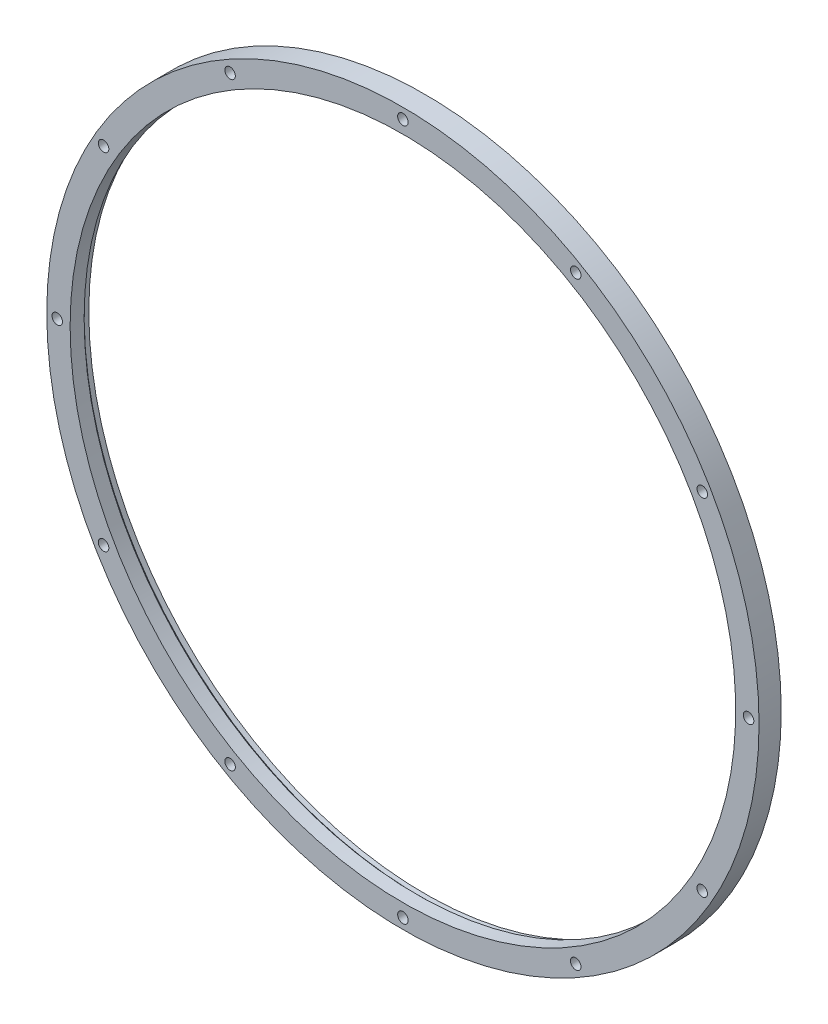
ISO-10303-21;
HEADER;
FILE_DESCRIPTION(('STEP AP214'),'2;1');
FILE_NAME('part.step','',(''),(''),'','','');
FILE_SCHEMA(('AUTOMOTIVE_DESIGN { 1 0 10303 214 1 1 1 1 }'));
ENDSEC;
DATA;
#1=APPLICATION_CONTEXT('core data for automotive mechanical design processes');
#2=APPLICATION_PROTOCOL_DEFINITION('international standard','automotive_design',2000,#1);
#3=PRODUCT_CONTEXT('',#1,'mechanical');
#4=PRODUCT('Part','Part','',(#3));
#5=PRODUCT_RELATED_PRODUCT_CATEGORY('part','',(#4));
#6=PRODUCT_DEFINITION_FORMATION('','',#4);
#7=PRODUCT_DEFINITION_CONTEXT('part definition',#1,'design');
#8=PRODUCT_DEFINITION('design','',#6,#7);
#9=PRODUCT_DEFINITION_SHAPE('','',#8);
#10=(LENGTH_UNIT() NAMED_UNIT(*) SI_UNIT(.MILLI.,.METRE.));
#11=(NAMED_UNIT(*) PLANE_ANGLE_UNIT() SI_UNIT($,.RADIAN.));
#12=(NAMED_UNIT(*) SI_UNIT($,.STERADIAN.) SOLID_ANGLE_UNIT());
#13=UNCERTAINTY_MEASURE_WITH_UNIT(LENGTH_MEASURE(1.E-05),#10,'distance_accuracy_value','');
#14=(GEOMETRIC_REPRESENTATION_CONTEXT(3) GLOBAL_UNCERTAINTY_ASSIGNED_CONTEXT((#13)) GLOBAL_UNIT_ASSIGNED_CONTEXT((#10,
#11,#12)) REPRESENTATION_CONTEXT('',''));
#15=CARTESIAN_POINT('',(0.,0.,0.));
#16=DIRECTION('',(0.,0.,1.));
#17=DIRECTION('',(1.,0.,0.));
#18=AXIS2_PLACEMENT_3D('',#15,#16,#17);
#19=CARTESIAN_POINT('',(256.3435195202,-148.,19.));
#20=DIRECTION('',(0.,0.,-1.));
#21=DIRECTION('',(-0.866025403784429,0.500000000000017,0.));
#22=AXIS2_PLACEMENT_3D('',#19,#20,#21);
#23=CYLINDRICAL_SURFACE('',#22,4.5);
#24=CARTESIAN_POINT('',(256.3435195202,-148.,19.));
#25=DIRECTION('',(0.,0.,-1.));
#26=DIRECTION('',(-0.866025403784429,0.500000000000017,0.));
#27=AXIS2_PLACEMENT_3D('',#24,#25,#26);
#28=CIRCLE('',#27,4.5);
#29=CARTESIAN_POINT('',(260.24063383723,-150.25,19.));
#30=VERTEX_POINT('',#29);
#31=EDGE_CURVE('E228',#30,#30,#28,.T.);
#32=ORIENTED_EDGE('',*,*,#31,.F.);
#33=DIRECTION('',(0.,0.,-1.));
#34=VECTOR('',#33,1.);
#35=CARTESIAN_POINT('',(260.24063383723,-150.25,19.));
#36=LINE('',#35,#34);
#37=CARTESIAN_POINT('',(260.24063383723,-150.25,0.));
#38=VERTEX_POINT('',#37);
#39=EDGE_CURVE('E11',#30,#38,#36,.T.);
#40=ORIENTED_EDGE('',*,*,#39,.T.);
#41=CARTESIAN_POINT('',(256.3435195202,-148.,0.));
#42=DIRECTION('',(0.,0.,-1.));
#43=DIRECTION('',(-0.866025403784429,0.500000000000017,0.));
#44=AXIS2_PLACEMENT_3D('',#41,#42,#43);
#45=CIRCLE('',#44,4.5);
#46=EDGE_CURVE('E251',#38,#38,#45,.T.);
#47=ORIENTED_EDGE('',*,*,#46,.T.);
#48=ORIENTED_EDGE('',*,*,#39,.F.);
#49=EDGE_LOOP('',(#32,#40,#47,#48));
#50=FACE_BOUND('',#49,.T.);
#51=ADVANCED_FACE('F17',(#50),#23,.F.);
#52=CARTESIAN_POINT('',(148.,-256.3435195202,19.));
#53=DIRECTION('',(0.,0.,-1.));
#54=DIRECTION('',(-0.500000000000017,0.866025403784429,0.));
#55=AXIS2_PLACEMENT_3D('',#52,#53,#54);
#56=CYLINDRICAL_SURFACE('',#55,4.5);
#57=CARTESIAN_POINT('',(148.,-256.3435195202,19.));
#58=DIRECTION('',(0.,0.,-1.));
#59=DIRECTION('',(-0.500000000000017,0.866025403784429,0.));
#60=AXIS2_PLACEMENT_3D('',#57,#58,#59);
#61=CIRCLE('',#60,4.5);
#62=CARTESIAN_POINT('',(150.25,-260.24063383723,19.));
#63=VERTEX_POINT('',#62);
#64=EDGE_CURVE('E224',#63,#63,#61,.T.);
#65=ORIENTED_EDGE('',*,*,#64,.F.);
#66=DIRECTION('',(0.,0.,-1.));
#67=VECTOR('',#66,1.);
#68=CARTESIAN_POINT('',(150.25,-260.24063383723,19.));
#69=LINE('',#68,#67);
#70=CARTESIAN_POINT('',(150.25,-260.24063383723,0.));
#71=VERTEX_POINT('',#70);
#72=EDGE_CURVE('E28',#63,#71,#69,.T.);
#73=ORIENTED_EDGE('',*,*,#72,.T.);
#74=CARTESIAN_POINT('',(148.,-256.3435195202,0.));
#75=DIRECTION('',(0.,0.,-1.));
#76=DIRECTION('',(-0.500000000000017,0.866025403784429,0.));
#77=AXIS2_PLACEMENT_3D('',#74,#75,#76);
#78=CIRCLE('',#77,4.5);
#79=EDGE_CURVE('E240',#71,#71,#78,.T.);
#80=ORIENTED_EDGE('',*,*,#79,.T.);
#81=ORIENTED_EDGE('',*,*,#72,.F.);
#82=EDGE_LOOP('',(#65,#73,#80,#81));
#83=FACE_BOUND('',#82,.T.);
#84=ADVANCED_FACE('F368',(#83),#56,.F.);
#85=CARTESIAN_POINT('',(0.,-296.,19.));
#86=DIRECTION('',(0.,0.,-1.));
#87=DIRECTION('',(0.,1.,0.));
#88=AXIS2_PLACEMENT_3D('',#85,#86,#87);
#89=CYLINDRICAL_SURFACE('',#88,4.5);
#90=CARTESIAN_POINT('',(0.,-296.,19.));
#91=DIRECTION('',(0.,0.,-1.));
#92=DIRECTION('',(0.,1.,0.));
#93=AXIS2_PLACEMENT_3D('',#90,#91,#92);
#94=CIRCLE('',#93,4.5);
#95=CARTESIAN_POINT('',(0.,-300.5,19.));
#96=VERTEX_POINT('',#95);
#97=EDGE_CURVE('E223',#96,#96,#94,.T.);
#98=ORIENTED_EDGE('',*,*,#97,.F.);
#99=DIRECTION('',(0.,0.,-1.));
#100=VECTOR('',#99,1.);
#101=CARTESIAN_POINT('',(0.,-300.5,19.));
#102=LINE('',#101,#100);
#103=CARTESIAN_POINT('',(0.,-300.5,0.));
#104=VERTEX_POINT('',#103);
#105=EDGE_CURVE('E279',#96,#104,#102,.T.);
#106=ORIENTED_EDGE('',*,*,#105,.T.);
#107=CARTESIAN_POINT('',(0.,-296.,0.));
#108=DIRECTION('',(0.,0.,-1.));
#109=DIRECTION('',(0.,1.,0.));
#110=AXIS2_PLACEMENT_3D('',#107,#108,#109);
#111=CIRCLE('',#110,4.5);
#112=EDGE_CURVE('E236',#104,#104,#111,.T.);
#113=ORIENTED_EDGE('',*,*,#112,.T.);
#114=ORIENTED_EDGE('',*,*,#105,.F.);
#115=EDGE_LOOP('',(#98,#106,#113,#114));
#116=FACE_BOUND('',#115,.T.);
#117=ADVANCED_FACE('F373',(#116),#89,.F.);
#118=CARTESIAN_POINT('',(-148.,-256.3435195202,19.));
#119=DIRECTION('',(0.,0.,-1.));
#120=DIRECTION('',(0.500000000000017,0.866025403784429,0.));
#121=AXIS2_PLACEMENT_3D('',#118,#119,#120);
#122=CYLINDRICAL_SURFACE('',#121,4.5);
#123=CARTESIAN_POINT('',(-148.,-256.3435195202,19.));
#124=DIRECTION('',(0.,0.,-1.));
#125=DIRECTION('',(0.500000000000017,0.866025403784429,0.));
#126=AXIS2_PLACEMENT_3D('',#123,#124,#125);
#127=CIRCLE('',#126,4.5);
#128=CARTESIAN_POINT('',(-150.25,-260.24063383723,19.));
#129=VERTEX_POINT('',#128);
#130=EDGE_CURVE('E207',#129,#129,#127,.T.);
#131=ORIENTED_EDGE('',*,*,#130,.F.);
#132=DIRECTION('',(0.,0.,-1.));
#133=VECTOR('',#132,1.);
#134=CARTESIAN_POINT('',(-150.25,-260.24063383723,19.));
#135=LINE('',#134,#133);
#136=CARTESIAN_POINT('',(-150.25,-260.24063383723,0.));
#137=VERTEX_POINT('',#136);
#138=EDGE_CURVE('E21',#129,#137,#135,.T.);
#139=ORIENTED_EDGE('',*,*,#138,.T.);
#140=CARTESIAN_POINT('',(-148.,-256.3435195202,0.));
#141=DIRECTION('',(0.,0.,-1.));
#142=DIRECTION('',(0.500000000000017,0.866025403784429,0.));
#143=AXIS2_PLACEMENT_3D('',#140,#141,#142);
#144=CIRCLE('',#143,4.5);
#145=EDGE_CURVE('E241',#137,#137,#144,.T.);
#146=ORIENTED_EDGE('',*,*,#145,.T.);
#147=ORIENTED_EDGE('',*,*,#138,.F.);
#148=EDGE_LOOP('',(#131,#139,#146,#147));
#149=FACE_BOUND('',#148,.T.);
#150=ADVANCED_FACE('F384',(#149),#122,.F.);
#151=CARTESIAN_POINT('',(-256.3435195202,-148.,19.));
#152=DIRECTION('',(0.,0.,-1.));
#153=DIRECTION('',(0.866025403784429,0.500000000000017,0.));
#154=AXIS2_PLACEMENT_3D('',#151,#152,#153);
#155=CYLINDRICAL_SURFACE('',#154,4.5);
#156=CARTESIAN_POINT('',(-256.3435195202,-148.,19.));
#157=DIRECTION('',(0.,0.,-1.));
#158=DIRECTION('',(0.866025403784429,0.500000000000017,0.));
#159=AXIS2_PLACEMENT_3D('',#156,#157,#158);
#160=CIRCLE('',#159,4.5);
#161=CARTESIAN_POINT('',(-260.24063383723,-150.25,19.));
#162=VERTEX_POINT('',#161);
#163=EDGE_CURVE('E198',#162,#162,#160,.T.);
#164=ORIENTED_EDGE('',*,*,#163,.F.);
#165=DIRECTION('',(0.,0.,-1.));
#166=VECTOR('',#165,1.);
#167=CARTESIAN_POINT('',(-260.24063383723,-150.25,19.));
#168=LINE('',#167,#166);
#169=CARTESIAN_POINT('',(-260.24063383723,-150.25,0.));
#170=VERTEX_POINT('',#169);
#171=EDGE_CURVE('E191',#162,#170,#168,.T.);
#172=ORIENTED_EDGE('',*,*,#171,.T.);
#173=CARTESIAN_POINT('',(-256.3435195202,-148.,0.));
#174=DIRECTION('',(0.,0.,-1.));
#175=DIRECTION('',(0.866025403784429,0.500000000000017,0.));
#176=AXIS2_PLACEMENT_3D('',#173,#174,#175);
#177=CIRCLE('',#176,4.5);
#178=EDGE_CURVE('E292',#170,#170,#177,.T.);
#179=ORIENTED_EDGE('',*,*,#178,.T.);
#180=ORIENTED_EDGE('',*,*,#171,.F.);
#181=EDGE_LOOP('',(#164,#172,#179,#180));
#182=FACE_BOUND('',#181,.T.);
#183=ADVANCED_FACE('F405',(#182),#155,.F.);
#184=CARTESIAN_POINT('',(-296.,0.,19.));
#185=DIRECTION('',(0.,0.,-1.));
#186=DIRECTION('',(1.,0.,0.));
#187=AXIS2_PLACEMENT_3D('',#184,#185,#186);
#188=CYLINDRICAL_SURFACE('',#187,4.5);
#189=CARTESIAN_POINT('',(-296.,0.,19.));
#190=DIRECTION('',(0.,0.,-1.));
#191=DIRECTION('',(1.,0.,0.));
#192=AXIS2_PLACEMENT_3D('',#189,#190,#191);
#193=CIRCLE('',#192,4.5);
#194=CARTESIAN_POINT('',(-300.5,0.,19.));
#195=VERTEX_POINT('',#194);
#196=EDGE_CURVE('E187',#195,#195,#193,.T.);
#197=ORIENTED_EDGE('',*,*,#196,.F.);
#198=DIRECTION('',(0.,0.,-1.));
#199=VECTOR('',#198,1.);
#200=CARTESIAN_POINT('',(-300.5,0.,19.));
#201=LINE('',#200,#199);
#202=CARTESIAN_POINT('',(-300.5,0.,0.));
#203=VERTEX_POINT('',#202);
#204=EDGE_CURVE('E184',#195,#203,#201,.T.);
#205=ORIENTED_EDGE('',*,*,#204,.T.);
#206=CARTESIAN_POINT('',(-296.,0.,0.));
#207=DIRECTION('',(0.,0.,-1.));
#208=DIRECTION('',(1.,0.,0.));
#209=AXIS2_PLACEMENT_3D('',#206,#207,#208);
#210=CIRCLE('',#209,4.5);
#211=EDGE_CURVE('E189',#203,#203,#210,.T.);
#212=ORIENTED_EDGE('',*,*,#211,.T.);
#213=ORIENTED_EDGE('',*,*,#204,.F.);
#214=EDGE_LOOP('',(#197,#205,#212,#213));
#215=FACE_BOUND('',#214,.T.);
#216=ADVANCED_FACE('F186',(#215),#188,.F.);
#217=CARTESIAN_POINT('',(-256.3435195202,148.,19.));
#218=DIRECTION('',(0.,0.,-1.));
#219=DIRECTION('',(0.866025403784429,-0.500000000000017,0.));
#220=AXIS2_PLACEMENT_3D('',#217,#218,#219);
#221=CYLINDRICAL_SURFACE('',#220,4.5);
#222=CARTESIAN_POINT('',(-256.3435195202,148.,19.));
#223=DIRECTION('',(0.,0.,-1.));
#224=DIRECTION('',(0.866025403784429,-0.500000000000017,0.));
#225=AXIS2_PLACEMENT_3D('',#222,#223,#224);
#226=CIRCLE('',#225,4.5);
#227=CARTESIAN_POINT('',(-260.24063383723,150.25,19.));
#228=VERTEX_POINT('',#227);
#229=EDGE_CURVE('E199',#228,#228,#226,.T.);
#230=ORIENTED_EDGE('',*,*,#229,.F.);
#231=DIRECTION('',(0.,0.,-1.));
#232=VECTOR('',#231,1.);
#233=CARTESIAN_POINT('',(-260.24063383723,150.25,19.));
#234=LINE('',#233,#232);
#235=CARTESIAN_POINT('',(-260.24063383723,150.25,0.));
#236=VERTEX_POINT('',#235);
#237=EDGE_CURVE('E192',#228,#236,#234,.T.);
#238=ORIENTED_EDGE('',*,*,#237,.T.);
#239=CARTESIAN_POINT('',(-256.3435195202,148.,0.));
#240=DIRECTION('',(0.,0.,-1.));
#241=DIRECTION('',(0.866025403784429,-0.500000000000017,0.));
#242=AXIS2_PLACEMENT_3D('',#239,#240,#241);
#243=CIRCLE('',#242,4.5);
#244=EDGE_CURVE('E255',#236,#236,#243,.T.);
#245=ORIENTED_EDGE('',*,*,#244,.T.);
#246=ORIENTED_EDGE('',*,*,#237,.F.);
#247=EDGE_LOOP('',(#230,#238,#245,#246));
#248=FACE_BOUND('',#247,.T.);
#249=ADVANCED_FACE('F377',(#248),#221,.F.);
#250=CARTESIAN_POINT('',(-148.,256.3435195202,19.));
#251=DIRECTION('',(0.,0.,-1.));
#252=DIRECTION('',(0.500000000000017,-0.866025403784429,0.));
#253=AXIS2_PLACEMENT_3D('',#250,#251,#252);
#254=CYLINDRICAL_SURFACE('',#253,4.5);
#255=CARTESIAN_POINT('',(-148.,256.3435195202,19.));
#256=DIRECTION('',(0.,0.,-1.));
#257=DIRECTION('',(0.500000000000017,-0.866025403784429,0.));
#258=AXIS2_PLACEMENT_3D('',#255,#256,#257);
#259=CIRCLE('',#258,4.5);
#260=CARTESIAN_POINT('',(-150.25,260.24063383723,19.));
#261=VERTEX_POINT('',#260);
#262=EDGE_CURVE('E210',#261,#261,#259,.T.);
#263=ORIENTED_EDGE('',*,*,#262,.F.);
#264=DIRECTION('',(0.,0.,-1.));
#265=VECTOR('',#264,1.);
#266=CARTESIAN_POINT('',(-150.25,260.24063383723,19.));
#267=LINE('',#266,#265);
#268=CARTESIAN_POINT('',(-150.25,260.24063383723,0.));
#269=VERTEX_POINT('',#268);
#270=EDGE_CURVE('E277',#261,#269,#267,.T.);
#271=ORIENTED_EDGE('',*,*,#270,.T.);
#272=CARTESIAN_POINT('',(-148.,256.3435195202,0.));
#273=DIRECTION('',(0.,0.,-1.));
#274=DIRECTION('',(0.500000000000017,-0.866025403784429,0.));
#275=AXIS2_PLACEMENT_3D('',#272,#273,#274);
#276=CIRCLE('',#275,4.5);
#277=EDGE_CURVE('E259',#269,#269,#276,.T.);
#278=ORIENTED_EDGE('',*,*,#277,.T.);
#279=ORIENTED_EDGE('',*,*,#270,.F.);
#280=EDGE_LOOP('',(#263,#271,#278,#279));
#281=FACE_BOUND('',#280,.T.);
#282=ADVANCED_FACE('F400',(#281),#254,.F.);
#283=CARTESIAN_POINT('',(0.,296.,19.));
#284=DIRECTION('',(0.,0.,-1.));
#285=DIRECTION('',(0.,-1.,0.));
#286=AXIS2_PLACEMENT_3D('',#283,#284,#285);
#287=CYLINDRICAL_SURFACE('',#286,4.5);
#288=CARTESIAN_POINT('',(0.,296.,19.));
#289=DIRECTION('',(0.,0.,-1.));
#290=DIRECTION('',(0.,-1.,0.));
#291=AXIS2_PLACEMENT_3D('',#288,#289,#290);
#292=CIRCLE('',#291,4.5);
#293=CARTESIAN_POINT('',(0.,300.5,19.));
#294=VERTEX_POINT('',#293);
#295=EDGE_CURVE('E333',#294,#294,#292,.T.);
#296=ORIENTED_EDGE('',*,*,#295,.F.);
#297=DIRECTION('',(0.,0.,-1.));
#298=VECTOR('',#297,1.);
#299=CARTESIAN_POINT('',(0.,300.5,19.));
#300=LINE('',#299,#298);
#301=CARTESIAN_POINT('',(0.,300.5,0.));
#302=VERTEX_POINT('',#301);
#303=EDGE_CURVE('E302',#294,#302,#300,.T.);
#304=ORIENTED_EDGE('',*,*,#303,.T.);
#305=CARTESIAN_POINT('',(0.,296.,0.));
#306=DIRECTION('',(0.,0.,-1.));
#307=DIRECTION('',(0.,-1.,0.));
#308=AXIS2_PLACEMENT_3D('',#305,#306,#307);
#309=CIRCLE('',#308,4.5);
#310=EDGE_CURVE('E274',#302,#302,#309,.T.);
#311=ORIENTED_EDGE('',*,*,#310,.T.);
#312=ORIENTED_EDGE('',*,*,#303,.F.);
#313=EDGE_LOOP('',(#296,#304,#311,#312));
#314=FACE_BOUND('',#313,.T.);
#315=ADVANCED_FACE('F389',(#314),#287,.F.);
#316=CARTESIAN_POINT('',(148.,256.3435195202,19.));
#317=DIRECTION('',(0.,0.,-1.));
#318=DIRECTION('',(-0.500000000000017,-0.866025403784429,0.));
#319=AXIS2_PLACEMENT_3D('',#316,#317,#318);
#320=CYLINDRICAL_SURFACE('',#319,4.5);
#321=CARTESIAN_POINT('',(148.,256.3435195202,19.));
#322=DIRECTION('',(0.,0.,-1.));
#323=DIRECTION('',(-0.500000000000017,-0.866025403784429,0.));
#324=AXIS2_PLACEMENT_3D('',#321,#322,#323);
#325=CIRCLE('',#324,4.5);
#326=CARTESIAN_POINT('',(150.25,260.24063383723,19.));
#327=VERTEX_POINT('',#326);
#328=EDGE_CURVE('E214',#327,#327,#325,.T.);
#329=ORIENTED_EDGE('',*,*,#328,.F.);
#330=DIRECTION('',(0.,0.,-1.));
#331=VECTOR('',#330,1.);
#332=CARTESIAN_POINT('',(150.25,260.24063383723,19.));
#333=LINE('',#332,#331);
#334=CARTESIAN_POINT('',(150.25,260.24063383723,0.));
#335=VERTEX_POINT('',#334);
#336=EDGE_CURVE('E144',#327,#335,#333,.T.);
#337=ORIENTED_EDGE('',*,*,#336,.T.);
#338=CARTESIAN_POINT('',(148.,256.3435195202,0.));
#339=DIRECTION('',(0.,0.,-1.));
#340=DIRECTION('',(-0.500000000000017,-0.866025403784429,0.));
#341=AXIS2_PLACEMENT_3D('',#338,#339,#340);
#342=CIRCLE('',#341,4.5);
#343=EDGE_CURVE('E266',#335,#335,#342,.T.);
#344=ORIENTED_EDGE('',*,*,#343,.T.);
#345=ORIENTED_EDGE('',*,*,#336,.F.);
#346=EDGE_LOOP('',(#329,#337,#344,#345));
#347=FACE_BOUND('',#346,.T.);
#348=ADVANCED_FACE('F381',(#347),#320,.F.);
#349=CARTESIAN_POINT('',(256.3435195202,148.,19.));
#350=DIRECTION('',(0.,0.,-1.));
#351=DIRECTION('',(-0.866025403784429,-0.500000000000017,0.));
#352=AXIS2_PLACEMENT_3D('',#349,#350,#351);
#353=CYLINDRICAL_SURFACE('',#352,4.5);
#354=CARTESIAN_POINT('',(256.3435195202,148.,19.));
#355=DIRECTION('',(0.,0.,-1.));
#356=DIRECTION('',(-0.866025403784429,-0.500000000000017,0.));
#357=AXIS2_PLACEMENT_3D('',#354,#355,#356);
#358=CIRCLE('',#357,4.5);
#359=CARTESIAN_POINT('',(260.24063383723,150.25,19.));
#360=VERTEX_POINT('',#359);
#361=EDGE_CURVE('E216',#360,#360,#358,.T.);
#362=ORIENTED_EDGE('',*,*,#361,.F.);
#363=DIRECTION('',(0.,0.,-1.));
#364=VECTOR('',#363,1.);
#365=CARTESIAN_POINT('',(260.24063383723,150.25,19.));
#366=LINE('',#365,#364);
#367=CARTESIAN_POINT('',(260.24063383723,150.25,0.));
#368=VERTEX_POINT('',#367);
#369=EDGE_CURVE('E156',#360,#368,#366,.T.);
#370=ORIENTED_EDGE('',*,*,#369,.T.);
#371=CARTESIAN_POINT('',(256.3435195202,148.,0.));
#372=DIRECTION('',(0.,0.,-1.));
#373=DIRECTION('',(-0.866025403784429,-0.500000000000017,0.));
#374=AXIS2_PLACEMENT_3D('',#371,#372,#373);
#375=CIRCLE('',#374,4.5);
#376=EDGE_CURVE('E263',#368,#368,#375,.T.);
#377=ORIENTED_EDGE('',*,*,#376,.T.);
#378=ORIENTED_EDGE('',*,*,#369,.F.);
#379=EDGE_LOOP('',(#362,#370,#377,#378));
#380=FACE_BOUND('',#379,.T.);
#381=ADVANCED_FACE('F378',(#380),#353,.F.);
#382=CARTESIAN_POINT('',(296.,0.,19.));
#383=DIRECTION('',(0.,0.,-1.));
#384=DIRECTION('',(-1.,0.,0.));
#385=AXIS2_PLACEMENT_3D('',#382,#383,#384);
#386=CYLINDRICAL_SURFACE('',#385,4.5);
#387=CARTESIAN_POINT('',(296.,0.,19.));
#388=DIRECTION('',(0.,0.,-1.));
#389=DIRECTION('',(-1.,0.,0.));
#390=AXIS2_PLACEMENT_3D('',#387,#388,#389);
#391=CIRCLE('',#390,4.5);
#392=CARTESIAN_POINT('',(300.5,0.,19.));
#393=VERTEX_POINT('',#392);
#394=EDGE_CURVE('E219',#393,#393,#391,.T.);
#395=ORIENTED_EDGE('',*,*,#394,.F.);
#396=DIRECTION('',(0.,0.,-1.));
#397=VECTOR('',#396,1.);
#398=CARTESIAN_POINT('',(300.5,0.,19.));
#399=LINE('',#398,#397);
#400=CARTESIAN_POINT('',(300.5,0.,0.));
#401=VERTEX_POINT('',#400);
#402=EDGE_CURVE('E260',#393,#401,#399,.T.);
#403=ORIENTED_EDGE('',*,*,#402,.T.);
#404=CARTESIAN_POINT('',(296.,0.,0.));
#405=DIRECTION('',(0.,0.,-1.));
#406=DIRECTION('',(-1.,0.,0.));
#407=AXIS2_PLACEMENT_3D('',#404,#405,#406);
#408=CIRCLE('',#407,4.5);
#409=EDGE_CURVE('E249',#401,#401,#408,.T.);
#410=ORIENTED_EDGE('',*,*,#409,.T.);
#411=ORIENTED_EDGE('',*,*,#402,.F.);
#412=EDGE_LOOP('',(#395,#403,#410,#411));
#413=FACE_BOUND('',#412,.T.);
#414=ADVANCED_FACE('F380',(#413),#386,.F.);
#415=CARTESIAN_POINT('',(0.,0.,0.));
#416=DIRECTION('',(0.,0.,-1.));
#417=DIRECTION('',(1.,0.,0.));
#418=AXIS2_PLACEMENT_3D('',#415,#416,#417);
#419=CYLINDRICAL_SURFACE('',#418,288.);
#420=CARTESIAN_POINT('',(0.,0.,5.));
#421=DIRECTION('',(0.,0.,-1.));
#422=DIRECTION('',(1.,0.,0.));
#423=AXIS2_PLACEMENT_3D('',#420,#421,#422);
#424=CIRCLE('',#423,288.);
#425=CARTESIAN_POINT('',(-288.,0.,5.));
#426=VERTEX_POINT('',#425);
#427=EDGE_CURVE('E270',#426,#426,#424,.T.);
#428=ORIENTED_EDGE('',*,*,#427,.F.);
#429=DIRECTION('',(0.,0.,-1.));
#430=VECTOR('',#429,1.);
#431=CARTESIAN_POINT('',(-288.,0.,0.));
#432=LINE('',#431,#430);
#433=CARTESIAN_POINT('',(-288.,0.,0.));
#434=VERTEX_POINT('',#433);
#435=EDGE_CURVE('E42',#426,#434,#432,.T.);
#436=ORIENTED_EDGE('',*,*,#435,.T.);
#437=CARTESIAN_POINT('',(0.,0.,0.));
#438=DIRECTION('',(0.,0.,-1.));
#439=DIRECTION('',(1.,0.,0.));
#440=AXIS2_PLACEMENT_3D('',#437,#438,#439);
#441=CIRCLE('',#440,288.);
#442=EDGE_CURVE('E246',#434,#434,#441,.T.);
#443=ORIENTED_EDGE('',*,*,#442,.T.);
#444=ORIENTED_EDGE('',*,*,#435,.F.);
#445=EDGE_LOOP('',(#428,#436,#443,#444));
#446=FACE_BOUND('',#445,.T.);
#447=ADVANCED_FACE('F395',(#446),#419,.F.);
#448=CARTESIAN_POINT('',(0.,0.,5.));
#449=DIRECTION('',(0.,0.,-1.));
#450=DIRECTION('',(0.,-1.,0.));
#451=AXIS2_PLACEMENT_3D('',#448,#449,#450);
#452=PLANE('',#451);
#453=CARTESIAN_POINT('',(0.,0.,5.));
#454=DIRECTION('',(0.,0.,-1.));
#455=DIRECTION('',(1.,0.,0.));
#456=AXIS2_PLACEMENT_3D('',#453,#454,#455);
#457=CIRCLE('',#456,287.);
#458=CARTESIAN_POINT('',(0.,286.999999999994,4.99999999999345));
#459=VERTEX_POINT('',#458);
#460=EDGE_CURVE('E267',#459,#459,#457,.T.);
#461=ORIENTED_EDGE('',*,*,#460,.F.);
#462=EDGE_LOOP('',(#461));
#463=FACE_BOUND('',#462,.T.);
#464=ORIENTED_EDGE('',*,*,#427,.T.);
#465=EDGE_LOOP('',(#464));
#466=FACE_BOUND('',#465,.T.);
#467=ADVANCED_FACE('F19',(#463,#466),#452,.T.);
#468=CARTESIAN_POINT('',(0.,0.,6.000000000687));
#469=DIRECTION('',(0.,0.,-1.));
#470=DIRECTION('',(0.,-1.,0.));
#471=AXIS2_PLACEMENT_3D('',#468,#469,#470);
#472=CONICAL_SURFACE('',#471,285.9999999993,0.785398163397448);
#473=CARTESIAN_POINT('',(0.,0.,7.));
#474=DIRECTION('',(0.,0.,-1.));
#475=DIRECTION('',(1.,0.,0.));
#476=AXIS2_PLACEMENT_3D('',#473,#474,#475);
#477=CIRCLE('',#476,285.);
#478=CARTESIAN_POINT('',(0.,284.999999999993,6.99999999999351));
#479=VERTEX_POINT('',#478);
#480=CARTESIAN_POINT('',(-285.,0.,7.));
#481=VERTEX_POINT('',#480);
#482=EDGE_CURVE('E283',#479,#481,#477,.T.);
#483=ORIENTED_EDGE('',*,*,#482,.F.);
#484=DIRECTION('',(0.,0.707106781186548,-0.707106781186548));
#485=VECTOR('',#484,1.);
#486=CARTESIAN_POINT('',(0.,285.9999999993,6.000000000687));
#487=LINE('',#486,#485);
#488=EDGE_CURVE('E83',#479,#459,#487,.T.);
#489=ORIENTED_EDGE('',*,*,#488,.T.);
#490=ORIENTED_EDGE('',*,*,#460,.T.);
#491=ORIENTED_EDGE('',*,*,#488,.F.);
#492=CARTESIAN_POINT('',(0.,0.,7.));
#493=DIRECTION('',(0.,0.,-1.));
#494=DIRECTION('',(1.,0.,0.));
#495=AXIS2_PLACEMENT_3D('',#492,#493,#494);
#496=CIRCLE('',#495,285.);
#497=EDGE_CURVE('E232',#481,#479,#496,.T.);
#498=ORIENTED_EDGE('',*,*,#497,.F.);
#499=EDGE_LOOP('',(#483,#489,#490,#491,#498));
#500=FACE_BOUND('',#499,.T.);
#501=ADVANCED_FACE('F393',(#500),#472,.F.);
#502=CARTESIAN_POINT('',(0.,0.,0.));
#503=DIRECTION('',(0.,0.,1.));
#504=DIRECTION('',(1.,0.,0.));
#505=AXIS2_PLACEMENT_3D('',#502,#503,#504);
#506=CYLINDRICAL_SURFACE('',#505,285.);
#507=ORIENTED_EDGE('',*,*,#482,.T.);
#508=DIRECTION('',(0.,0.,1.));
#509=VECTOR('',#508,1.);
#510=CARTESIAN_POINT('',(-285.,0.,0.));
#511=LINE('',#510,#509);
#512=CARTESIAN_POINT('',(-285.,0.,19.));
#513=VERTEX_POINT('',#512);
#514=EDGE_CURVE('E235',#481,#513,#511,.T.);
#515=ORIENTED_EDGE('',*,*,#514,.T.);
#516=CARTESIAN_POINT('',(0.,0.,19.));
#517=DIRECTION('',(0.,0.,-1.));
#518=DIRECTION('',(1.,0.,0.));
#519=AXIS2_PLACEMENT_3D('',#516,#517,#518);
#520=CIRCLE('',#519,285.);
#521=EDGE_CURVE('E245',#513,#513,#520,.T.);
#522=ORIENTED_EDGE('',*,*,#521,.F.);
#523=ORIENTED_EDGE('',*,*,#514,.F.);
#524=ORIENTED_EDGE('',*,*,#497,.T.);
#525=EDGE_LOOP('',(#507,#515,#522,#523,#524));
#526=FACE_BOUND('',#525,.T.);
#527=ADVANCED_FACE('F390',(#526),#506,.F.);
#528=CARTESIAN_POINT('',(0.,0.,19.));
#529=DIRECTION('',(0.,0.,1.));
#530=DIRECTION('',(1.,0.,0.));
#531=AXIS2_PLACEMENT_3D('',#528,#529,#530);
#532=PLANE('',#531);
#533=ORIENTED_EDGE('',*,*,#31,.T.);
#534=EDGE_LOOP('',(#533));
#535=FACE_BOUND('',#534,.T.);
#536=ORIENTED_EDGE('',*,*,#64,.T.);
#537=EDGE_LOOP('',(#536));
#538=FACE_BOUND('',#537,.T.);
#539=ORIENTED_EDGE('',*,*,#97,.T.);
#540=EDGE_LOOP('',(#539));
#541=FACE_BOUND('',#540,.T.);
#542=ORIENTED_EDGE('',*,*,#130,.T.);
#543=EDGE_LOOP('',(#542));
#544=FACE_BOUND('',#543,.T.);
#545=ORIENTED_EDGE('',*,*,#163,.T.);
#546=EDGE_LOOP('',(#545));
#547=FACE_BOUND('',#546,.T.);
#548=ORIENTED_EDGE('',*,*,#196,.T.);
#549=EDGE_LOOP('',(#548));
#550=FACE_BOUND('',#549,.T.);
#551=ORIENTED_EDGE('',*,*,#229,.T.);
#552=EDGE_LOOP('',(#551));
#553=FACE_BOUND('',#552,.T.);
#554=ORIENTED_EDGE('',*,*,#262,.T.);
#555=EDGE_LOOP('',(#554));
#556=FACE_BOUND('',#555,.T.);
#557=ORIENTED_EDGE('',*,*,#295,.T.);
#558=EDGE_LOOP('',(#557));
#559=FACE_BOUND('',#558,.T.);
#560=ORIENTED_EDGE('',*,*,#328,.T.);
#561=EDGE_LOOP('',(#560));
#562=FACE_BOUND('',#561,.T.);
#563=ORIENTED_EDGE('',*,*,#361,.T.);
#564=EDGE_LOOP('',(#563));
#565=FACE_BOUND('',#564,.T.);
#566=ORIENTED_EDGE('',*,*,#394,.T.);
#567=EDGE_LOOP('',(#566));
#568=FACE_BOUND('',#567,.T.);
#569=ORIENTED_EDGE('',*,*,#521,.T.);
#570=EDGE_LOOP('',(#569));
#571=FACE_BOUND('',#570,.T.);
#572=CARTESIAN_POINT('',(0.,0.,19.));
#573=DIRECTION('',(0.,0.,1.));
#574=DIRECTION('',(1.,0.,0.));
#575=AXIS2_PLACEMENT_3D('',#572,#573,#574);
#576=CIRCLE('',#575,305.);
#577=CARTESIAN_POINT('',(-305.,0.,19.));
#578=VERTEX_POINT('',#577);
#579=EDGE_CURVE('E254',#578,#578,#576,.T.);
#580=ORIENTED_EDGE('',*,*,#579,.T.);
#581=EDGE_LOOP('',(#580));
#582=FACE_BOUND('',#581,.T.);
#583=ADVANCED_FACE('F195',(#535,#538,#541,#544,#547,#550,#553,#556,#559,#562,#565,#568,#571,
#582),#532,.T.);
#584=CARTESIAN_POINT('',(0.,0.,0.));
#585=DIRECTION('',(0.,0.,1.));
#586=DIRECTION('',(1.,0.,0.));
#587=AXIS2_PLACEMENT_3D('',#584,#585,#586);
#588=CYLINDRICAL_SURFACE('',#587,305.);
#589=ORIENTED_EDGE('',*,*,#579,.F.);
#590=DIRECTION('',(0.,0.,-1.));
#591=VECTOR('',#590,1.);
#592=CARTESIAN_POINT('',(-305.,0.,0.));
#593=LINE('',#592,#591);
#594=CARTESIAN_POINT('',(-305.,0.,0.));
#595=VERTEX_POINT('',#594);
#596=EDGE_CURVE('E325',#578,#595,#593,.T.);
#597=ORIENTED_EDGE('',*,*,#596,.T.);
#598=CARTESIAN_POINT('',(0.,0.,0.));
#599=DIRECTION('',(0.,0.,1.));
#600=DIRECTION('',(1.,0.,0.));
#601=AXIS2_PLACEMENT_3D('',#598,#599,#600);
#602=CIRCLE('',#601,305.);
#603=EDGE_CURVE('E250',#595,#595,#602,.T.);
#604=ORIENTED_EDGE('',*,*,#603,.T.);
#605=ORIENTED_EDGE('',*,*,#596,.F.);
#606=EDGE_LOOP('',(#589,#597,#604,#605));
#607=FACE_BOUND('',#606,.T.);
#608=ADVANCED_FACE('F351',(#607),#588,.T.);
#609=CARTESIAN_POINT('',(0.,0.,0.));
#610=DIRECTION('',(0.,0.,1.));
#611=DIRECTION('',(1.,0.,0.));
#612=AXIS2_PLACEMENT_3D('',#609,#610,#611);
#613=PLANE('',#612);
#614=ORIENTED_EDGE('',*,*,#46,.F.);
#615=EDGE_LOOP('',(#614));
#616=FACE_BOUND('',#615,.T.);
#617=ORIENTED_EDGE('',*,*,#79,.F.);
#618=EDGE_LOOP('',(#617));
#619=FACE_BOUND('',#618,.T.);
#620=ORIENTED_EDGE('',*,*,#112,.F.);
#621=EDGE_LOOP('',(#620));
#622=FACE_BOUND('',#621,.T.);
#623=ORIENTED_EDGE('',*,*,#145,.F.);
#624=EDGE_LOOP('',(#623));
#625=FACE_BOUND('',#624,.T.);
#626=ORIENTED_EDGE('',*,*,#178,.F.);
#627=EDGE_LOOP('',(#626));
#628=FACE_BOUND('',#627,.T.);
#629=ORIENTED_EDGE('',*,*,#211,.F.);
#630=EDGE_LOOP('',(#629));
#631=FACE_BOUND('',#630,.T.);
#632=ORIENTED_EDGE('',*,*,#244,.F.);
#633=EDGE_LOOP('',(#632));
#634=FACE_BOUND('',#633,.T.);
#635=ORIENTED_EDGE('',*,*,#277,.F.);
#636=EDGE_LOOP('',(#635));
#637=FACE_BOUND('',#636,.T.);
#638=ORIENTED_EDGE('',*,*,#310,.F.);
#639=EDGE_LOOP('',(#638));
#640=FACE_BOUND('',#639,.T.);
#641=ORIENTED_EDGE('',*,*,#343,.F.);
#642=EDGE_LOOP('',(#641));
#643=FACE_BOUND('',#642,.T.);
#644=ORIENTED_EDGE('',*,*,#376,.F.);
#645=EDGE_LOOP('',(#644));
#646=FACE_BOUND('',#645,.T.);
#647=ORIENTED_EDGE('',*,*,#409,.F.);
#648=EDGE_LOOP('',(#647));
#649=FACE_BOUND('',#648,.T.);
#650=ORIENTED_EDGE('',*,*,#442,.F.);
#651=EDGE_LOOP('',(#650));
#652=FACE_BOUND('',#651,.T.);
#653=ORIENTED_EDGE('',*,*,#603,.F.);
#654=EDGE_LOOP('',(#653));
#655=FACE_BOUND('',#654,.T.);
#656=ADVANCED_FACE('F354',(#616,#619,#622,#625,#628,#631,#634,#637,#640,#643,#646,#649,#652,
#655),#613,.F.);
#657=CLOSED_SHELL('',(#51,#84,#117,#150,#183,#216,#249,#282,#315,#348,#381,#414,#447,#467,#501,
#527,#583,#608,#656));
#658=MANIFOLD_SOLID_BREP('B1',#657);
#659=ADVANCED_BREP_SHAPE_REPRESENTATION('',(#18,#658),#14);
#660=SHAPE_DEFINITION_REPRESENTATION(#9,#659);
ENDSEC;
END-ISO-10303-21;
